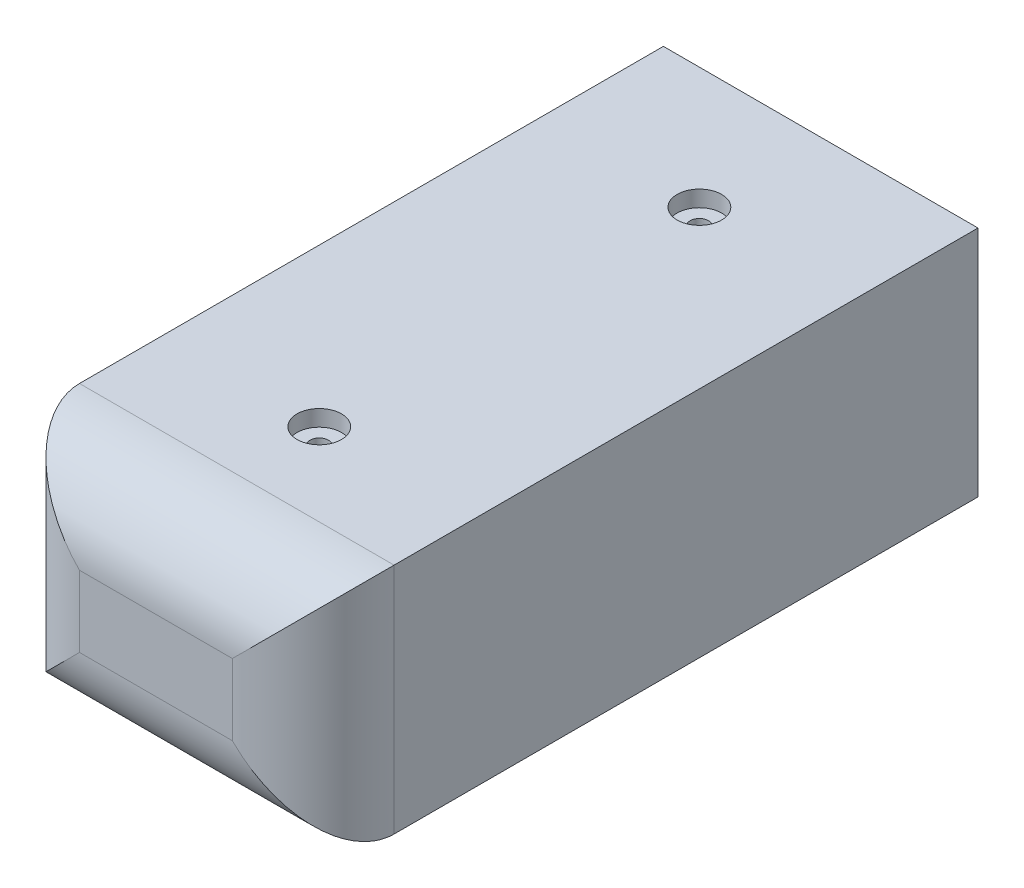
ISO-10303-21;
HEADER;
FILE_DESCRIPTION(('STEP AP214'),'2;1');
FILE_NAME('part.step','',(''),(''),'','','');
FILE_SCHEMA(('AUTOMOTIVE_DESIGN { 1 0 10303 214 1 1 1 1 }'));
ENDSEC;
DATA;
#1=APPLICATION_CONTEXT('core data for automotive mechanical design processes');
#2=APPLICATION_PROTOCOL_DEFINITION('international standard','automotive_design',2000,#1);
#3=PRODUCT_CONTEXT('',#1,'mechanical');
#4=PRODUCT('Part','Part','',(#3));
#5=PRODUCT_RELATED_PRODUCT_CATEGORY('part','',(#4));
#6=PRODUCT_DEFINITION_FORMATION('','',#4);
#7=PRODUCT_DEFINITION_CONTEXT('part definition',#1,'design');
#8=PRODUCT_DEFINITION('design','',#6,#7);
#9=PRODUCT_DEFINITION_SHAPE('','',#8);
#10=(LENGTH_UNIT() NAMED_UNIT(*) SI_UNIT(.MILLI.,.METRE.));
#11=(NAMED_UNIT(*) PLANE_ANGLE_UNIT() SI_UNIT($,.RADIAN.));
#12=(NAMED_UNIT(*) SI_UNIT($,.STERADIAN.) SOLID_ANGLE_UNIT());
#13=UNCERTAINTY_MEASURE_WITH_UNIT(LENGTH_MEASURE(1.E-05),#10,'distance_accuracy_value','');
#14=(GEOMETRIC_REPRESENTATION_CONTEXT(3) GLOBAL_UNCERTAINTY_ASSIGNED_CONTEXT((#13)) GLOBAL_UNIT_ASSIGNED_CONTEXT((#10,
#11,#12)) REPRESENTATION_CONTEXT('',''));
#15=CARTESIAN_POINT('',(0.,0.,0.));
#16=DIRECTION('',(0.,0.,1.));
#17=DIRECTION('',(1.,0.,0.));
#18=AXIS2_PLACEMENT_3D('',#15,#16,#17);
#19=CARTESIAN_POINT('',(0.,0.,328.8));
#20=DIRECTION('',(0.,0.,1.));
#21=DIRECTION('',(1.,0.,0.));
#22=AXIS2_PLACEMENT_3D('',#19,#20,#21);
#23=PLANE('',#22);
#24=DIRECTION('',(1.,0.,0.));
#25=VECTOR('',#24,1.);
#26=CARTESIAN_POINT('',(-251.,-17.6,328.8));
#27=LINE('',#26,#25);
#28=CARTESIAN_POINT('',(-37.8,-17.6,328.8));
#29=VERTEX_POINT('',#28);
#30=CARTESIAN_POINT('',(37.8,-17.6,328.8));
#31=VERTEX_POINT('',#30);
#32=EDGE_CURVE('E140',#29,#31,#27,.T.);
#33=ORIENTED_EDGE('',*,*,#32,.T.);
#34=DIRECTION('',(0.,1.,0.));
#35=VECTOR('',#34,1.);
#36=CARTESIAN_POINT('',(37.8,-271.2,328.8));
#37=LINE('',#36,#35);
#38=CARTESIAN_POINT('',(37.8,17.6,328.8));
#39=VERTEX_POINT('',#38);
#40=EDGE_CURVE('E61',#31,#39,#37,.T.);
#41=ORIENTED_EDGE('',*,*,#40,.T.);
#42=DIRECTION('',(1.,0.,0.));
#43=VECTOR('',#42,1.);
#44=CARTESIAN_POINT('',(-251.,17.6,328.8));
#45=LINE('',#44,#43);
#46=CARTESIAN_POINT('',(-37.8,17.6,328.8));
#47=VERTEX_POINT('',#46);
#48=EDGE_CURVE('E166',#39,#47,#45,.F.);
#49=ORIENTED_EDGE('',*,*,#48,.T.);
#50=DIRECTION('',(0.,1.,0.));
#51=VECTOR('',#50,1.);
#52=CARTESIAN_POINT('',(-37.8,-271.2,328.8));
#53=LINE('',#52,#51);
#54=EDGE_CURVE('E132',#29,#47,#53,.T.);
#55=ORIENTED_EDGE('',*,*,#54,.F.);
#56=EDGE_LOOP('',(#33,#41,#49,#55));
#57=FACE_BOUND('',#56,.T.);
#58=ADVANCED_FACE('F46',(#57),#23,.T.);
#59=CARTESIAN_POINT('',(77.8,-57.6,328.8));
#60=DIRECTION('',(-1.,0.,0.));
#61=DIRECTION('',(0.,0.,1.));
#62=AXIS2_PLACEMENT_3D('',#59,#60,#61);
#63=PLANE('',#62);
#64=DIRECTION('',(0.,1.,0.));
#65=VECTOR('',#64,1.);
#66=CARTESIAN_POINT('',(77.8,-271.2,288.8));
#67=LINE('',#66,#65);
#68=CARTESIAN_POINT('',(77.8,-57.6,288.8));
#69=VERTEX_POINT('',#68);
#70=CARTESIAN_POINT('',(77.8,57.6,288.8));
#71=VERTEX_POINT('',#70);
#72=EDGE_CURVE('E127',#69,#71,#67,.T.);
#73=ORIENTED_EDGE('',*,*,#72,.F.);
#74=DIRECTION('',(0.,0.,-1.));
#75=VECTOR('',#74,1.);
#76=CARTESIAN_POINT('',(77.8,-57.6,328.8));
#77=LINE('',#76,#75);
#78=CARTESIAN_POINT('',(77.8,-57.6,0.));
#79=VERTEX_POINT('',#78);
#80=EDGE_CURVE('E162',#69,#79,#77,.T.);
#81=ORIENTED_EDGE('',*,*,#80,.T.);
#82=DIRECTION('',(0.,1.,0.));
#83=VECTOR('',#82,1.);
#84=CARTESIAN_POINT('',(77.8,-57.6,0.));
#85=LINE('',#84,#83);
#86=CARTESIAN_POINT('',(77.8,57.6,0.));
#87=VERTEX_POINT('',#86);
#88=EDGE_CURVE('E154',#79,#87,#85,.T.);
#89=ORIENTED_EDGE('',*,*,#88,.T.);
#90=DIRECTION('',(0.,0.,-1.));
#91=VECTOR('',#90,1.);
#92=CARTESIAN_POINT('',(77.8,57.6,328.8));
#93=LINE('',#92,#91);
#94=EDGE_CURVE('E160',#71,#87,#93,.T.);
#95=ORIENTED_EDGE('',*,*,#94,.F.);
#96=EDGE_LOOP('',(#73,#81,#89,#95));
#97=FACE_BOUND('',#96,.T.);
#98=ADVANCED_FACE('F183',(#97),#63,.F.);
#99=CARTESIAN_POINT('',(-251.,17.6,288.8));
#100=DIRECTION('',(1.,0.,0.));
#101=DIRECTION('',(0.,0.,-1.));
#102=AXIS2_PLACEMENT_3D('',#99,#100,#101);
#103=CYLINDRICAL_SURFACE('',#102,40.);
#104=CARTESIAN_POINT('',(37.8,17.6,288.8));
#105=DIRECTION('',(0.707106781186547,-0.707106781186547,0.));
#106=DIRECTION('',(0.707106781186547,0.707106781186547,0.));
#107=AXIS2_PLACEMENT_3D('',#104,#105,#106);
#108=ELLIPSE('',#107,56.5685424949238,40.);
#109=EDGE_CURVE('E129',#71,#39,#108,.T.);
#110=ORIENTED_EDGE('',*,*,#109,.F.);
#111=DIRECTION('',(1.,0.,0.));
#112=VECTOR('',#111,1.);
#113=CARTESIAN_POINT('',(-251.,57.6,288.8));
#114=LINE('',#113,#112);
#115=CARTESIAN_POINT('',(-77.8,57.6,288.8));
#116=VERTEX_POINT('',#115);
#117=EDGE_CURVE('E144',#116,#71,#114,.T.);
#118=ORIENTED_EDGE('',*,*,#117,.F.);
#119=CARTESIAN_POINT('',(-37.8,17.6,288.8));
#120=DIRECTION('',(0.707106781186547,0.707106781186547,0.));
#121=DIRECTION('',(0.707106781186547,-0.707106781186547,0.));
#122=AXIS2_PLACEMENT_3D('',#119,#120,#121);
#123=ELLIPSE('',#122,56.5685424949238,40.);
#124=EDGE_CURVE('E135',#116,#47,#123,.T.);
#125=ORIENTED_EDGE('',*,*,#124,.T.);
#126=ORIENTED_EDGE('',*,*,#48,.F.);
#127=EDGE_LOOP('',(#110,#118,#125,#126));
#128=FACE_BOUND('',#127,.T.);
#129=ADVANCED_FACE('F191',(#128),#103,.T.);
#130=CARTESIAN_POINT('',(-251.,-17.6,288.8));
#131=DIRECTION('',(1.,0.,0.));
#132=DIRECTION('',(0.,0.,-1.));
#133=AXIS2_PLACEMENT_3D('',#130,#131,#132);
#134=CYLINDRICAL_SURFACE('',#133,40.);
#135=DIRECTION('',(1.,0.,0.));
#136=VECTOR('',#135,1.);
#137=CARTESIAN_POINT('',(-251.,-57.6,288.8));
#138=LINE('',#137,#136);
#139=CARTESIAN_POINT('',(-77.8,-57.6,288.8));
#140=VERTEX_POINT('',#139);
#141=EDGE_CURVE('E141',#140,#69,#138,.T.);
#142=ORIENTED_EDGE('',*,*,#141,.T.);
#143=CARTESIAN_POINT('',(37.8,-17.6,288.8));
#144=DIRECTION('',(0.707106781186547,0.707106781186547,0.));
#145=DIRECTION('',(0.707106781186547,-0.707106781186547,0.));
#146=AXIS2_PLACEMENT_3D('',#143,#144,#145);
#147=ELLIPSE('',#146,56.5685424949238,40.);
#148=EDGE_CURVE('E13',#69,#31,#147,.F.);
#149=ORIENTED_EDGE('',*,*,#148,.T.);
#150=ORIENTED_EDGE('',*,*,#32,.F.);
#151=CARTESIAN_POINT('',(-37.8,-17.6,288.8));
#152=DIRECTION('',(0.707106781186547,-0.707106781186547,0.));
#153=DIRECTION('',(0.707106781186547,0.707106781186547,0.));
#154=AXIS2_PLACEMENT_3D('',#151,#152,#153);
#155=ELLIPSE('',#154,56.5685424949238,40.);
#156=EDGE_CURVE('E54',#140,#29,#155,.F.);
#157=ORIENTED_EDGE('',*,*,#156,.F.);
#158=EDGE_LOOP('',(#142,#149,#150,#157));
#159=FACE_BOUND('',#158,.T.);
#160=ADVANCED_FACE('F176',(#159),#134,.T.);
#161=CARTESIAN_POINT('',(-77.8,-57.6,328.8));
#162=DIRECTION('',(1.,0.,0.));
#163=DIRECTION('',(0.,0.,-1.));
#164=AXIS2_PLACEMENT_3D('',#161,#162,#163);
#165=PLANE('',#164);
#166=DIRECTION('',(0.,1.,0.));
#167=VECTOR('',#166,1.);
#168=CARTESIAN_POINT('',(-77.8,-271.2,288.8));
#169=LINE('',#168,#167);
#170=EDGE_CURVE('E133',#140,#116,#169,.T.);
#171=ORIENTED_EDGE('',*,*,#170,.T.);
#172=DIRECTION('',(0.,0.,-1.));
#173=VECTOR('',#172,1.);
#174=CARTESIAN_POINT('',(-77.8,57.6,328.8));
#175=LINE('',#174,#173);
#176=CARTESIAN_POINT('',(-77.8,57.6,0.));
#177=VERTEX_POINT('',#176);
#178=EDGE_CURVE('E68',#116,#177,#175,.T.);
#179=ORIENTED_EDGE('',*,*,#178,.T.);
#180=DIRECTION('',(0.,-1.,0.));
#181=VECTOR('',#180,1.);
#182=CARTESIAN_POINT('',(-77.8,-57.6,0.));
#183=LINE('',#182,#181);
#184=CARTESIAN_POINT('',(-77.8,-57.6,0.));
#185=VERTEX_POINT('',#184);
#186=EDGE_CURVE('E149',#177,#185,#183,.T.);
#187=ORIENTED_EDGE('',*,*,#186,.T.);
#188=DIRECTION('',(0.,0.,-1.));
#189=VECTOR('',#188,1.);
#190=CARTESIAN_POINT('',(-77.8,-57.6,328.8));
#191=LINE('',#190,#189);
#192=EDGE_CURVE('E164',#140,#185,#191,.T.);
#193=ORIENTED_EDGE('',*,*,#192,.F.);
#194=EDGE_LOOP('',(#171,#179,#187,#193));
#195=FACE_BOUND('',#194,.T.);
#196=ADVANCED_FACE('F48',(#195),#165,.F.);
#197=CARTESIAN_POINT('',(77.8,-57.6,328.8));
#198=DIRECTION('',(0.,1.,0.));
#199=DIRECTION('',(-1.,0.,0.));
#200=AXIS2_PLACEMENT_3D('',#197,#198,#199);
#201=PLANE('',#200);
#202=CARTESIAN_POINT('',(0.,-57.6,248.));
#203=DIRECTION('',(0.,-1.,0.));
#204=DIRECTION('',(0.,0.,-1.));
#205=AXIS2_PLACEMENT_3D('',#202,#203,#204);
#206=CIRCLE('',#205,7.5);
#207=CARTESIAN_POINT('',(0.,-57.6,240.5));
#208=VERTEX_POINT('',#207);
#209=EDGE_CURVE('E281',#208,#208,#206,.T.);
#210=ORIENTED_EDGE('',*,*,#209,.F.);
#211=EDGE_LOOP('',(#210));
#212=FACE_BOUND('',#211,.T.);
#213=CARTESIAN_POINT('',(0.,-57.6,60.));
#214=DIRECTION('',(0.,-1.,0.));
#215=DIRECTION('',(0.,0.,-1.));
#216=AXIS2_PLACEMENT_3D('',#213,#214,#215);
#217=CIRCLE('',#216,7.5);
#218=CARTESIAN_POINT('',(0.,-57.6,52.5));
#219=VERTEX_POINT('',#218);
#220=EDGE_CURVE('E289',#219,#219,#217,.T.);
#221=ORIENTED_EDGE('',*,*,#220,.F.);
#222=EDGE_LOOP('',(#221));
#223=FACE_BOUND('',#222,.T.);
#224=DIRECTION('',(1.,0.,0.));
#225=VECTOR('',#224,1.);
#226=CARTESIAN_POINT('',(77.8,-57.6,0.));
#227=LINE('',#226,#225);
#228=EDGE_CURVE('E151',#185,#79,#227,.T.);
#229=ORIENTED_EDGE('',*,*,#228,.T.);
#230=ORIENTED_EDGE('',*,*,#80,.F.);
#231=ORIENTED_EDGE('',*,*,#141,.F.);
#232=ORIENTED_EDGE('',*,*,#192,.T.);
#233=EDGE_LOOP('',(#229,#230,#231,#232));
#234=FACE_BOUND('',#233,.T.);
#235=ADVANCED_FACE('F195',(#212,#223,#234),#201,.F.);
#236=CARTESIAN_POINT('',(77.8,57.6,328.8));
#237=DIRECTION('',(0.,-1.,0.));
#238=DIRECTION('',(1.,0.,0.));
#239=AXIS2_PLACEMENT_3D('',#236,#237,#238);
#240=PLANE('',#239);
#241=CARTESIAN_POINT('',(0.,57.6,248.));
#242=DIRECTION('',(0.,1.,0.));
#243=DIRECTION('',(0.,0.,1.));
#244=AXIS2_PLACEMENT_3D('',#241,#242,#243);
#245=CIRCLE('',#244,11.);
#246=CARTESIAN_POINT('',(0.,57.6,259.));
#247=VERTEX_POINT('',#246);
#248=EDGE_CURVE('E298',#247,#247,#245,.T.);
#249=ORIENTED_EDGE('',*,*,#248,.F.);
#250=EDGE_LOOP('',(#249));
#251=FACE_BOUND('',#250,.T.);
#252=CARTESIAN_POINT('',(0.,57.6,60.));
#253=DIRECTION('',(0.,1.,0.));
#254=DIRECTION('',(0.,0.,1.));
#255=AXIS2_PLACEMENT_3D('',#252,#253,#254);
#256=CIRCLE('',#255,11.);
#257=CARTESIAN_POINT('',(0.,57.6,71.));
#258=VERTEX_POINT('',#257);
#259=EDGE_CURVE('E307',#258,#258,#256,.T.);
#260=ORIENTED_EDGE('',*,*,#259,.F.);
#261=EDGE_LOOP('',(#260));
#262=FACE_BOUND('',#261,.T.);
#263=DIRECTION('',(-1.,0.,0.));
#264=VECTOR('',#263,1.);
#265=CARTESIAN_POINT('',(77.8,57.6,0.));
#266=LINE('',#265,#264);
#267=EDGE_CURVE('E157',#87,#177,#266,.T.);
#268=ORIENTED_EDGE('',*,*,#267,.T.);
#269=ORIENTED_EDGE('',*,*,#178,.F.);
#270=ORIENTED_EDGE('',*,*,#117,.T.);
#271=ORIENTED_EDGE('',*,*,#94,.T.);
#272=EDGE_LOOP('',(#268,#269,#270,#271));
#273=FACE_BOUND('',#272,.T.);
#274=ADVANCED_FACE('F187',(#251,#262,#273),#240,.F.);
#275=CARTESIAN_POINT('',(0.,0.,0.));
#276=DIRECTION('',(0.,0.,1.));
#277=DIRECTION('',(1.,0.,0.));
#278=AXIS2_PLACEMENT_3D('',#275,#276,#277);
#279=PLANE('',#278);
#280=CARTESIAN_POINT('',(47.8,0.,0.));
#281=DIRECTION('',(0.,0.,-1.));
#282=DIRECTION('',(-1.,0.,0.));
#283=AXIS2_PLACEMENT_3D('',#280,#281,#282);
#284=CIRCLE('',#283,3.4);
#285=CARTESIAN_POINT('',(44.4,0.,0.));
#286=VERTEX_POINT('',#285);
#287=EDGE_CURVE('E115',#286,#286,#284,.T.);
#288=ORIENTED_EDGE('',*,*,#287,.F.);
#289=EDGE_LOOP('',(#288));
#290=FACE_BOUND('',#289,.T.);
#291=CARTESIAN_POINT('',(-47.8,0.,0.));
#292=DIRECTION('',(0.,0.,-1.));
#293=DIRECTION('',(-1.,0.,0.));
#294=AXIS2_PLACEMENT_3D('',#291,#292,#293);
#295=CIRCLE('',#294,3.4);
#296=CARTESIAN_POINT('',(-51.2,0.,0.));
#297=VERTEX_POINT('',#296);
#298=EDGE_CURVE('E114',#297,#297,#295,.T.);
#299=ORIENTED_EDGE('',*,*,#298,.F.);
#300=EDGE_LOOP('',(#299));
#301=FACE_BOUND('',#300,.T.);
#302=ORIENTED_EDGE('',*,*,#186,.F.);
#303=ORIENTED_EDGE('',*,*,#267,.F.);
#304=ORIENTED_EDGE('',*,*,#88,.F.);
#305=ORIENTED_EDGE('',*,*,#228,.F.);
#306=EDGE_LOOP('',(#302,#303,#304,#305));
#307=FACE_BOUND('',#306,.T.);
#308=ADVANCED_FACE('F197',(#290,#301,#307),#279,.F.);
#309=CARTESIAN_POINT('',(-37.8,-271.2,288.8));
#310=DIRECTION('',(0.,1.,0.));
#311=DIRECTION('',(-1.,0.,0.));
#312=AXIS2_PLACEMENT_3D('',#309,#310,#311);
#313=CYLINDRICAL_SURFACE('',#312,40.);
#314=ORIENTED_EDGE('',*,*,#170,.F.);
#315=ORIENTED_EDGE('',*,*,#156,.T.);
#316=ORIENTED_EDGE('',*,*,#54,.T.);
#317=ORIENTED_EDGE('',*,*,#124,.F.);
#318=EDGE_LOOP('',(#314,#315,#316,#317));
#319=FACE_BOUND('',#318,.T.);
#320=ADVANCED_FACE('F170',(#319),#313,.T.);
#321=CARTESIAN_POINT('',(37.8,-271.2,288.8));
#322=DIRECTION('',(0.,1.,0.));
#323=DIRECTION('',(-1.,0.,0.));
#324=AXIS2_PLACEMENT_3D('',#321,#322,#323);
#325=CYLINDRICAL_SURFACE('',#324,40.);
#326=ORIENTED_EDGE('',*,*,#109,.T.);
#327=ORIENTED_EDGE('',*,*,#40,.F.);
#328=ORIENTED_EDGE('',*,*,#148,.F.);
#329=ORIENTED_EDGE('',*,*,#72,.T.);
#330=EDGE_LOOP('',(#326,#327,#328,#329));
#331=FACE_BOUND('',#330,.T.);
#332=ADVANCED_FACE('F179',(#331),#325,.T.);
#333=CARTESIAN_POINT('',(-47.8,0.,30.));
#334=DIRECTION('',(0.,0.,-1.));
#335=DIRECTION('',(-1.,0.,0.));
#336=AXIS2_PLACEMENT_3D('',#333,#334,#335);
#337=CONICAL_SURFACE('',#336,3.39999999999999,1.02974425867665);
#338=CARTESIAN_POINT('',(-47.8,0.,32.0429261046937));
#339=VERTEX_POINT('',#338);
#340=VERTEX_LOOP('',#339);
#341=FACE_BOUND('',#340,.T.);
#342=CARTESIAN_POINT('',(-47.8,0.,30.));
#343=DIRECTION('',(0.,0.,-1.));
#344=DIRECTION('',(-1.,0.,0.));
#345=AXIS2_PLACEMENT_3D('',#342,#343,#344);
#346=CIRCLE('',#345,3.39999999999999);
#347=CARTESIAN_POINT('',(-51.2,0.,30.));
#348=VERTEX_POINT('',#347);
#349=EDGE_CURVE('E118',#348,#348,#346,.T.);
#350=ORIENTED_EDGE('',*,*,#349,.T.);
#351=EDGE_LOOP('',(#350));
#352=FACE_BOUND('',#351,.T.);
#353=ADVANCED_FACE('F225',(#341,#352),#337,.F.);
#354=CARTESIAN_POINT('',(-47.8,0.,0.));
#355=DIRECTION('',(0.,0.,-1.));
#356=DIRECTION('',(-1.,0.,0.));
#357=AXIS2_PLACEMENT_3D('',#354,#355,#356);
#358=CYLINDRICAL_SURFACE('',#357,3.4);
#359=ORIENTED_EDGE('',*,*,#349,.F.);
#360=EDGE_LOOP('',(#359));
#361=FACE_BOUND('',#360,.T.);
#362=ORIENTED_EDGE('',*,*,#298,.T.);
#363=EDGE_LOOP('',(#362));
#364=FACE_BOUND('',#363,.T.);
#365=ADVANCED_FACE('F108',(#361,#364),#358,.F.);
#366=CARTESIAN_POINT('',(47.8,0.,30.));
#367=DIRECTION('',(0.,0.,-1.));
#368=DIRECTION('',(-1.,0.,0.));
#369=AXIS2_PLACEMENT_3D('',#366,#367,#368);
#370=CONICAL_SURFACE('',#369,3.39999999999999,1.02974425867665);
#371=CARTESIAN_POINT('',(47.8,0.,32.0429261046937));
#372=VERTEX_POINT('',#371);
#373=VERTEX_LOOP('',#372);
#374=FACE_BOUND('',#373,.T.);
#375=CARTESIAN_POINT('',(47.8,0.,30.));
#376=DIRECTION('',(0.,0.,-1.));
#377=DIRECTION('',(-1.,0.,0.));
#378=AXIS2_PLACEMENT_3D('',#375,#376,#377);
#379=CIRCLE('',#378,3.39999999999999);
#380=CARTESIAN_POINT('',(44.4,0.,30.));
#381=VERTEX_POINT('',#380);
#382=EDGE_CURVE('E112',#381,#381,#379,.T.);
#383=ORIENTED_EDGE('',*,*,#382,.T.);
#384=EDGE_LOOP('',(#383));
#385=FACE_BOUND('',#384,.T.);
#386=ADVANCED_FACE('F104',(#374,#385),#370,.F.);
#387=CARTESIAN_POINT('',(47.8,0.,0.));
#388=DIRECTION('',(0.,0.,-1.));
#389=DIRECTION('',(-1.,0.,0.));
#390=AXIS2_PLACEMENT_3D('',#387,#388,#389);
#391=CYLINDRICAL_SURFACE('',#390,3.4);
#392=ORIENTED_EDGE('',*,*,#382,.F.);
#393=EDGE_LOOP('',(#392));
#394=FACE_BOUND('',#393,.T.);
#395=ORIENTED_EDGE('',*,*,#287,.T.);
#396=EDGE_LOOP('',(#395));
#397=FACE_BOUND('',#396,.T.);
#398=ADVANCED_FACE('F107',(#394,#397),#391,.F.);
#399=CARTESIAN_POINT('',(0.,57.6,60.));
#400=DIRECTION('',(0.,1.,0.));
#401=DIRECTION('',(0.,0.,1.));
#402=AXIS2_PLACEMENT_3D('',#399,#400,#401);
#403=CYLINDRICAL_SURFACE('',#402,4.49999999999999);
#404=CARTESIAN_POINT('',(0.,-49.6,60.));
#405=DIRECTION('',(0.,-1.,0.));
#406=DIRECTION('',(0.,0.,-1.));
#407=AXIS2_PLACEMENT_3D('',#404,#405,#406);
#408=CIRCLE('',#407,4.50000000000001);
#409=CARTESIAN_POINT('',(0.,-49.6,55.5));
#410=VERTEX_POINT('',#409);
#411=EDGE_CURVE('E295',#410,#410,#408,.T.);
#412=ORIENTED_EDGE('',*,*,#411,.T.);
#413=EDGE_LOOP('',(#412));
#414=FACE_BOUND('',#413,.T.);
#415=CARTESIAN_POINT('',(0.,49.6,60.));
#416=DIRECTION('',(0.,1.,0.));
#417=DIRECTION('',(0.,0.,1.));
#418=AXIS2_PLACEMENT_3D('',#415,#416,#417);
#419=CIRCLE('',#418,4.50000000000001);
#420=CARTESIAN_POINT('',(0.,49.6,64.5));
#421=VERTEX_POINT('',#420);
#422=EDGE_CURVE('E121',#421,#421,#419,.T.);
#423=ORIENTED_EDGE('',*,*,#422,.T.);
#424=EDGE_LOOP('',(#423));
#425=FACE_BOUND('',#424,.T.);
#426=ADVANCED_FACE('F234',(#414,#425),#403,.F.);
#427=CARTESIAN_POINT('',(4.50000000000001,49.6,60.));
#428=DIRECTION('',(0.,-1.,0.));
#429=DIRECTION('',(0.,0.,-1.));
#430=AXIS2_PLACEMENT_3D('',#427,#428,#429);
#431=PLANE('',#430);
#432=ORIENTED_EDGE('',*,*,#422,.F.);
#433=EDGE_LOOP('',(#432));
#434=FACE_BOUND('',#433,.T.);
#435=CARTESIAN_POINT('',(0.,49.6,60.));
#436=DIRECTION('',(0.,1.,0.));
#437=DIRECTION('',(0.,0.,1.));
#438=AXIS2_PLACEMENT_3D('',#435,#436,#437);
#439=CIRCLE('',#438,11.);
#440=CARTESIAN_POINT('',(0.,49.6,71.));
#441=VERTEX_POINT('',#440);
#442=EDGE_CURVE('E310',#441,#441,#439,.T.);
#443=ORIENTED_EDGE('',*,*,#442,.T.);
#444=EDGE_LOOP('',(#443));
#445=FACE_BOUND('',#444,.T.);
#446=ADVANCED_FACE('F237',(#434,#445),#431,.F.);
#447=CARTESIAN_POINT('',(0.,57.6,60.));
#448=DIRECTION('',(0.,1.,0.));
#449=DIRECTION('',(0.,0.,1.));
#450=AXIS2_PLACEMENT_3D('',#447,#448,#449);
#451=CYLINDRICAL_SURFACE('',#450,11.);
#452=ORIENTED_EDGE('',*,*,#442,.F.);
#453=EDGE_LOOP('',(#452));
#454=FACE_BOUND('',#453,.T.);
#455=ORIENTED_EDGE('',*,*,#259,.T.);
#456=EDGE_LOOP('',(#455));
#457=FACE_BOUND('',#456,.T.);
#458=ADVANCED_FACE('F241',(#454,#457),#451,.F.);
#459=CARTESIAN_POINT('',(0.,57.6,248.));
#460=DIRECTION('',(0.,1.,0.));
#461=DIRECTION('',(0.,0.,1.));
#462=AXIS2_PLACEMENT_3D('',#459,#460,#461);
#463=CYLINDRICAL_SURFACE('',#462,4.49999999999999);
#464=CARTESIAN_POINT('',(0.,-49.6,248.));
#465=DIRECTION('',(0.,-1.,0.));
#466=DIRECTION('',(0.,0.,-1.));
#467=AXIS2_PLACEMENT_3D('',#464,#465,#466);
#468=CIRCLE('',#467,4.50000000000001);
#469=CARTESIAN_POINT('',(0.,-49.6,243.5));
#470=VERTEX_POINT('',#469);
#471=EDGE_CURVE('E284',#470,#470,#468,.T.);
#472=ORIENTED_EDGE('',*,*,#471,.T.);
#473=EDGE_LOOP('',(#472));
#474=FACE_BOUND('',#473,.T.);
#475=CARTESIAN_POINT('',(0.,49.6,248.));
#476=DIRECTION('',(0.,1.,0.));
#477=DIRECTION('',(0.,0.,1.));
#478=AXIS2_PLACEMENT_3D('',#475,#476,#477);
#479=CIRCLE('',#478,4.50000000000001);
#480=CARTESIAN_POINT('',(0.,49.6,252.5));
#481=VERTEX_POINT('',#480);
#482=EDGE_CURVE('E304',#481,#481,#479,.T.);
#483=ORIENTED_EDGE('',*,*,#482,.T.);
#484=EDGE_LOOP('',(#483));
#485=FACE_BOUND('',#484,.T.);
#486=ADVANCED_FACE('F245',(#474,#485),#463,.F.);
#487=CARTESIAN_POINT('',(4.50000000000001,49.6,248.));
#488=DIRECTION('',(0.,-1.,0.));
#489=DIRECTION('',(0.,0.,-1.));
#490=AXIS2_PLACEMENT_3D('',#487,#488,#489);
#491=PLANE('',#490);
#492=ORIENTED_EDGE('',*,*,#482,.F.);
#493=EDGE_LOOP('',(#492));
#494=FACE_BOUND('',#493,.T.);
#495=CARTESIAN_POINT('',(0.,49.6,248.));
#496=DIRECTION('',(0.,1.,0.));
#497=DIRECTION('',(0.,0.,1.));
#498=AXIS2_PLACEMENT_3D('',#495,#496,#497);
#499=CIRCLE('',#498,11.);
#500=CARTESIAN_POINT('',(0.,49.6,259.));
#501=VERTEX_POINT('',#500);
#502=EDGE_CURVE('E301',#501,#501,#499,.T.);
#503=ORIENTED_EDGE('',*,*,#502,.T.);
#504=EDGE_LOOP('',(#503));
#505=FACE_BOUND('',#504,.T.);
#506=ADVANCED_FACE('F249',(#494,#505),#491,.F.);
#507=CARTESIAN_POINT('',(0.,57.6,248.));
#508=DIRECTION('',(0.,1.,0.));
#509=DIRECTION('',(0.,0.,1.));
#510=AXIS2_PLACEMENT_3D('',#507,#508,#509);
#511=CYLINDRICAL_SURFACE('',#510,11.);
#512=ORIENTED_EDGE('',*,*,#502,.F.);
#513=EDGE_LOOP('',(#512));
#514=FACE_BOUND('',#513,.T.);
#515=ORIENTED_EDGE('',*,*,#248,.T.);
#516=EDGE_LOOP('',(#515));
#517=FACE_BOUND('',#516,.T.);
#518=ADVANCED_FACE('F253',(#514,#517),#511,.F.);
#519=CARTESIAN_POINT('',(4.50000000000001,-49.6,60.));
#520=DIRECTION('',(0.,1.,0.));
#521=DIRECTION('',(0.,0.,1.));
#522=AXIS2_PLACEMENT_3D('',#519,#520,#521);
#523=PLANE('',#522);
#524=ORIENTED_EDGE('',*,*,#411,.F.);
#525=EDGE_LOOP('',(#524));
#526=FACE_BOUND('',#525,.T.);
#527=CARTESIAN_POINT('',(0.,-49.6,60.));
#528=DIRECTION('',(0.,-1.,0.));
#529=DIRECTION('',(0.,0.,-1.));
#530=AXIS2_PLACEMENT_3D('',#527,#528,#529);
#531=CIRCLE('',#530,7.5);
#532=CARTESIAN_POINT('',(0.,-49.6,52.5));
#533=VERTEX_POINT('',#532);
#534=EDGE_CURVE('E292',#533,#533,#531,.T.);
#535=ORIENTED_EDGE('',*,*,#534,.T.);
#536=EDGE_LOOP('',(#535));
#537=FACE_BOUND('',#536,.T.);
#538=ADVANCED_FACE('F257',(#526,#537),#523,.F.);
#539=CARTESIAN_POINT('',(0.,-57.6,60.));
#540=DIRECTION('',(0.,-1.,0.));
#541=DIRECTION('',(0.,0.,-1.));
#542=AXIS2_PLACEMENT_3D('',#539,#540,#541);
#543=CYLINDRICAL_SURFACE('',#542,7.5);
#544=ORIENTED_EDGE('',*,*,#534,.F.);
#545=EDGE_LOOP('',(#544));
#546=FACE_BOUND('',#545,.T.);
#547=ORIENTED_EDGE('',*,*,#220,.T.);
#548=EDGE_LOOP('',(#547));
#549=FACE_BOUND('',#548,.T.);
#550=ADVANCED_FACE('F261',(#546,#549),#543,.F.);
#551=CARTESIAN_POINT('',(4.50000000000001,-49.6,248.));
#552=DIRECTION('',(0.,1.,0.));
#553=DIRECTION('',(0.,0.,1.));
#554=AXIS2_PLACEMENT_3D('',#551,#552,#553);
#555=PLANE('',#554);
#556=ORIENTED_EDGE('',*,*,#471,.F.);
#557=EDGE_LOOP('',(#556));
#558=FACE_BOUND('',#557,.T.);
#559=CARTESIAN_POINT('',(0.,-49.6,248.));
#560=DIRECTION('',(0.,-1.,0.));
#561=DIRECTION('',(0.,0.,-1.));
#562=AXIS2_PLACEMENT_3D('',#559,#560,#561);
#563=CIRCLE('',#562,7.5);
#564=CARTESIAN_POINT('',(0.,-49.6,240.5));
#565=VERTEX_POINT('',#564);
#566=EDGE_CURVE('E278',#565,#565,#563,.T.);
#567=ORIENTED_EDGE('',*,*,#566,.T.);
#568=EDGE_LOOP('',(#567));
#569=FACE_BOUND('',#568,.T.);
#570=ADVANCED_FACE('F265',(#558,#569),#555,.F.);
#571=CARTESIAN_POINT('',(0.,-57.6,248.));
#572=DIRECTION('',(0.,-1.,0.));
#573=DIRECTION('',(0.,0.,-1.));
#574=AXIS2_PLACEMENT_3D('',#571,#572,#573);
#575=CYLINDRICAL_SURFACE('',#574,7.5);
#576=ORIENTED_EDGE('',*,*,#566,.F.);
#577=EDGE_LOOP('',(#576));
#578=FACE_BOUND('',#577,.T.);
#579=ORIENTED_EDGE('',*,*,#209,.T.);
#580=EDGE_LOOP('',(#579));
#581=FACE_BOUND('',#580,.T.);
#582=ADVANCED_FACE('F269',(#578,#581),#575,.F.);
#583=CLOSED_SHELL('',(#58,#98,#129,#160,#196,#235,#274,#308,#320,#332,#353,#365,#386,#398,#426,
#446,#458,#486,#506,#518,#538,#550,#570,#582));
#584=MANIFOLD_SOLID_BREP('B2',#583);
#585=ADVANCED_BREP_SHAPE_REPRESENTATION('',(#18,#584),#14);
#586=SHAPE_DEFINITION_REPRESENTATION(#9,#585);
ENDSEC;
END-ISO-10303-21;
